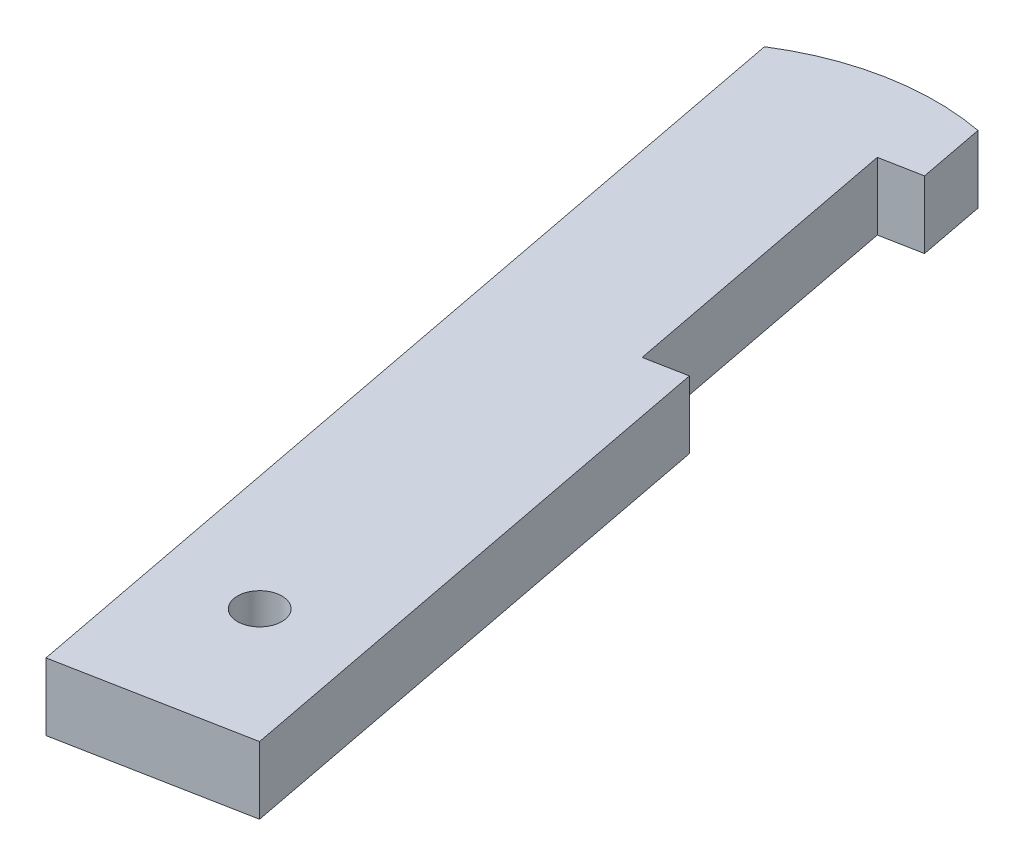
ISO-10303-21;
HEADER;
FILE_DESCRIPTION(('STEP AP214'),'2;1');
FILE_NAME('part.step','',(''),(''),'','','');
FILE_SCHEMA(('AUTOMOTIVE_DESIGN { 1 0 10303 214 1 1 1 1 }'));
ENDSEC;
DATA;
#1=APPLICATION_CONTEXT('core data for automotive mechanical design processes');
#2=APPLICATION_PROTOCOL_DEFINITION('international standard','automotive_design',2000,#1);
#3=PRODUCT_CONTEXT('',#1,'mechanical');
#4=PRODUCT('Part','Part','',(#3));
#5=PRODUCT_RELATED_PRODUCT_CATEGORY('part','',(#4));
#6=PRODUCT_DEFINITION_FORMATION('','',#4);
#7=PRODUCT_DEFINITION_CONTEXT('part definition',#1,'design');
#8=PRODUCT_DEFINITION('design','',#6,#7);
#9=PRODUCT_DEFINITION_SHAPE('','',#8);
#10=(LENGTH_UNIT() NAMED_UNIT(*) SI_UNIT(.MILLI.,.METRE.));
#11=(NAMED_UNIT(*) PLANE_ANGLE_UNIT() SI_UNIT($,.RADIAN.));
#12=(NAMED_UNIT(*) SI_UNIT($,.STERADIAN.) SOLID_ANGLE_UNIT());
#13=UNCERTAINTY_MEASURE_WITH_UNIT(LENGTH_MEASURE(1.E-05),#10,'distance_accuracy_value','');
#14=(GEOMETRIC_REPRESENTATION_CONTEXT(3) GLOBAL_UNCERTAINTY_ASSIGNED_CONTEXT((#13)) GLOBAL_UNIT_ASSIGNED_CONTEXT((#10,
#11,#12)) REPRESENTATION_CONTEXT('',''));
#15=CARTESIAN_POINT('',(0.,0.,0.));
#16=DIRECTION('',(0.,0.,1.));
#17=DIRECTION('',(1.,0.,0.));
#18=AXIS2_PLACEMENT_3D('',#15,#16,#17);
#19=CARTESIAN_POINT('',(0.,5.,0.));
#20=DIRECTION('',(0.,1.,0.));
#21=DIRECTION('',(0.,0.,1.));
#22=AXIS2_PLACEMENT_3D('',#19,#20,#21);
#23=PLANE('',#22);
#24=CARTESIAN_POINT('',(0.,5.,0.));
#25=DIRECTION('',(0.,1.,0.));
#26=DIRECTION('',(0.,0.,1.));
#27=AXIS2_PLACEMENT_3D('',#24,#25,#26);
#28=CIRCLE('',#27,18.5);
#29=CARTESIAN_POINT('',(3.42343920553594,5.,-18.1804858022551));
#30=VERTEX_POINT('',#29);
#31=CARTESIAN_POINT('',(-9.89482128749764,5.,-15.6314590390176));
#32=VERTEX_POINT('',#31);
#33=EDGE_CURVE('E145',#30,#32,#28,.T.);
#34=ORIENTED_EDGE('',*,*,#33,.T.);
#35=DIRECTION('',(0.187981324722533,0.,0.982172602731089));
#36=VECTOR('',#35,1.);
#37=CARTESIAN_POINT('',(-9.89482128749764,5.,-15.6314590390176));
#38=LINE('',#37,#36);
#39=CARTESIAN_POINT('',(2.73993598960987,5.,50.3831435181732));
#40=VERTEX_POINT('',#39);
#41=EDGE_CURVE('E93',#32,#40,#38,.T.);
#42=ORIENTED_EDGE('',*,*,#41,.T.);
#43=DIRECTION('',(0.982172602731089,0.,-0.187981324722533));
#44=VECTOR('',#43,1.);
#45=CARTESIAN_POINT('',(2.73993598960987,5.,50.3831435181732));
#46=LINE('',#45,#44);
#47=CARTESIAN_POINT('',(16.0581964826435,5.,47.8341167549357));
#48=VERTEX_POINT('',#47);
#49=EDGE_CURVE('E160',#40,#48,#46,.T.);
#50=ORIENTED_EDGE('',*,*,#49,.T.);
#51=DIRECTION('',(-0.187981324722534,0.,-0.982172602731089));
#52=VECTOR('',#51,1.);
#53=CARTESIAN_POINT('',(8.49893497304433,5.,8.3381744714843));
#54=LINE('',#53,#52);
#55=CARTESIAN_POINT('',(8.49893497304433,5.,8.3381744714843));
#56=VERTEX_POINT('',#55);
#57=EDGE_CURVE('E173',#48,#56,#54,.T.);
#58=ORIENTED_EDGE('',*,*,#57,.T.);
#59=DIRECTION('',(-0.982172602731089,0.,0.187981324722533));
#60=VECTOR('',#59,1.);
#61=CARTESIAN_POINT('',(5.55241716485106,5.,8.9021184456519));
#62=LINE('',#61,#60);
#63=CARTESIAN_POINT('',(5.55241716485106,5.,8.9021184456519));
#64=VERTEX_POINT('',#63);
#65=EDGE_CURVE('E112',#56,#64,#62,.T.);
#66=ORIENTED_EDGE('',*,*,#65,.T.);
#67=DIRECTION('',(-0.187981324722533,0.,-0.982172602731089));
#68=VECTOR('',#67,1.);
#69=CARTESIAN_POINT('',(1.41682802095533,5.,-12.7056788144321));
#70=LINE('',#69,#68);
#71=CARTESIAN_POINT('',(1.41682802095533,5.,-12.7056788144321));
#72=VERTEX_POINT('',#71);
#73=EDGE_CURVE('E106',#64,#72,#70,.T.);
#74=ORIENTED_EDGE('',*,*,#73,.T.);
#75=DIRECTION('',(0.982172602731089,0.,-0.187981324722533));
#76=VECTOR('',#75,1.);
#77=CARTESIAN_POINT('',(4.3633458291486,5.,-13.2696227885997));
#78=LINE('',#77,#76);
#79=CARTESIAN_POINT('',(4.3633458291486,5.,-13.2696227885997));
#80=VERTEX_POINT('',#79);
#81=EDGE_CURVE('E110',#72,#80,#78,.T.);
#82=ORIENTED_EDGE('',*,*,#81,.T.);
#83=DIRECTION('',(-0.187981324722532,0.,-0.982172602731089));
#84=VECTOR('',#83,1.);
#85=CARTESIAN_POINT('',(3.42343920553594,5.,-18.1804858022551));
#86=LINE('',#85,#84);
#87=EDGE_CURVE('E50',#80,#30,#86,.T.);
#88=ORIENTED_EDGE('',*,*,#87,.T.);
#89=EDGE_LOOP('',(#34,#42,#50,#58,#66,#74,#82,#88));
#90=FACE_BOUND('',#89,.T.);
#91=CARTESIAN_POINT('',(7.51925298890133,5.,39.2869041092436));
#92=DIRECTION('',(0.,1.,0.));
#93=DIRECTION('',(0.,0.,1.));
#94=AXIS2_PLACEMENT_3D('',#91,#92,#93);
#95=CIRCLE('',#94,1.65);
#96=CARTESIAN_POINT('',(7.51925298890133,5.,40.9369041092436));
#97=VERTEX_POINT('',#96);
#98=EDGE_CURVE('E134',#97,#97,#95,.T.);
#99=ORIENTED_EDGE('',*,*,#98,.F.);
#100=EDGE_LOOP('',(#99));
#101=FACE_BOUND('',#100,.T.);
#102=ADVANCED_FACE('F33',(#90,#101),#23,.T.);
#103=CARTESIAN_POINT('',(0.,0.,0.));
#104=DIRECTION('',(0.,1.,0.));
#105=DIRECTION('',(0.,0.,1.));
#106=AXIS2_PLACEMENT_3D('',#103,#104,#105);
#107=PLANE('',#106);
#108=CARTESIAN_POINT('',(0.,0.,0.));
#109=DIRECTION('',(0.,1.,0.));
#110=DIRECTION('',(0.,0.,1.));
#111=AXIS2_PLACEMENT_3D('',#108,#109,#110);
#112=CIRCLE('',#111,18.5);
#113=CARTESIAN_POINT('',(3.42343920553594,0.,-18.1804858022551));
#114=VERTEX_POINT('',#113);
#115=CARTESIAN_POINT('',(-9.89482128749764,0.,-15.6314590390176));
#116=VERTEX_POINT('',#115);
#117=EDGE_CURVE('E130',#114,#116,#112,.T.);
#118=ORIENTED_EDGE('',*,*,#117,.F.);
#119=DIRECTION('',(-0.187981324722532,0.,-0.982172602731089));
#120=VECTOR('',#119,1.);
#121=CARTESIAN_POINT('',(3.42343920553594,0.,-18.1804858022551));
#122=LINE('',#121,#120);
#123=CARTESIAN_POINT('',(4.3633458291486,0.,-13.2696227885997));
#124=VERTEX_POINT('',#123);
#125=EDGE_CURVE('E85',#124,#114,#122,.T.);
#126=ORIENTED_EDGE('',*,*,#125,.F.);
#127=DIRECTION('',(0.982172602731089,0.,-0.187981324722533));
#128=VECTOR('',#127,1.);
#129=CARTESIAN_POINT('',(4.3633458291486,0.,-13.2696227885997));
#130=LINE('',#129,#128);
#131=CARTESIAN_POINT('',(1.41682802095533,0.,-12.7056788144321));
#132=VERTEX_POINT('',#131);
#133=EDGE_CURVE('E79',#132,#124,#130,.T.);
#134=ORIENTED_EDGE('',*,*,#133,.F.);
#135=DIRECTION('',(-0.187981324722533,0.,-0.982172602731089));
#136=VECTOR('',#135,1.);
#137=CARTESIAN_POINT('',(1.41682802095533,0.,-12.7056788144321));
#138=LINE('',#137,#136);
#139=CARTESIAN_POINT('',(5.55241716485106,0.,8.9021184456519));
#140=VERTEX_POINT('',#139);
#141=EDGE_CURVE('E120',#140,#132,#138,.T.);
#142=ORIENTED_EDGE('',*,*,#141,.F.);
#143=DIRECTION('',(-0.982172602731089,0.,0.187981324722533));
#144=VECTOR('',#143,1.);
#145=CARTESIAN_POINT('',(5.55241716485106,0.,8.9021184456519));
#146=LINE('',#145,#144);
#147=CARTESIAN_POINT('',(8.49893497304433,0.,8.3381744714843));
#148=VERTEX_POINT('',#147);
#149=EDGE_CURVE('E140',#148,#140,#146,.T.);
#150=ORIENTED_EDGE('',*,*,#149,.F.);
#151=DIRECTION('',(-0.187981324722534,0.,-0.982172602731089));
#152=VECTOR('',#151,1.);
#153=CARTESIAN_POINT('',(8.49893497304433,0.,8.3381744714843));
#154=LINE('',#153,#152);
#155=CARTESIAN_POINT('',(16.0581964826435,0.,47.8341167549357));
#156=VERTEX_POINT('',#155);
#157=EDGE_CURVE('E138',#156,#148,#154,.T.);
#158=ORIENTED_EDGE('',*,*,#157,.F.);
#159=DIRECTION('',(0.982172602731089,0.,-0.187981324722533));
#160=VECTOR('',#159,1.);
#161=CARTESIAN_POINT('',(2.73993598960987,0.,50.3831435181732));
#162=LINE('',#161,#160);
#163=CARTESIAN_POINT('',(2.73993598960987,0.,50.3831435181732));
#164=VERTEX_POINT('',#163);
#165=EDGE_CURVE('E136',#164,#156,#162,.T.);
#166=ORIENTED_EDGE('',*,*,#165,.F.);
#167=DIRECTION('',(0.187981324722533,0.,0.982172602731089));
#168=VECTOR('',#167,1.);
#169=CARTESIAN_POINT('',(-9.89482128749764,0.,-15.6314590390176));
#170=LINE('',#169,#168);
#171=EDGE_CURVE('E133',#116,#164,#170,.T.);
#172=ORIENTED_EDGE('',*,*,#171,.F.);
#173=EDGE_LOOP('',(#118,#126,#134,#142,#150,#158,#166,#172));
#174=FACE_BOUND('',#173,.T.);
#175=CARTESIAN_POINT('',(7.51925298890133,0.,39.2869041092436));
#176=DIRECTION('',(0.,1.,0.));
#177=DIRECTION('',(0.,0.,1.));
#178=AXIS2_PLACEMENT_3D('',#175,#176,#177);
#179=CIRCLE('',#178,1.65);
#180=CARTESIAN_POINT('',(7.51925298890133,0.,40.9369041092436));
#181=VERTEX_POINT('',#180);
#182=EDGE_CURVE('E179',#181,#181,#179,.T.);
#183=ORIENTED_EDGE('',*,*,#182,.T.);
#184=EDGE_LOOP('',(#183));
#185=FACE_BOUND('',#184,.T.);
#186=ADVANCED_FACE('F164',(#174,#185),#107,.F.);
#187=CARTESIAN_POINT('',(0.,5.,0.));
#188=DIRECTION('',(0.,-1.,0.));
#189=DIRECTION('',(0.,0.,-1.));
#190=AXIS2_PLACEMENT_3D('',#187,#188,#189);
#191=CYLINDRICAL_SURFACE('',#190,18.5);
#192=ORIENTED_EDGE('',*,*,#117,.T.);
#193=DIRECTION('',(0.,-1.,0.));
#194=VECTOR('',#193,1.);
#195=CARTESIAN_POINT('',(-9.89482128749764,5.,-15.6314590390176));
#196=LINE('',#195,#194);
#197=EDGE_CURVE('E11',#32,#116,#196,.T.);
#198=ORIENTED_EDGE('',*,*,#197,.F.);
#199=ORIENTED_EDGE('',*,*,#33,.F.);
#200=DIRECTION('',(0.,-1.,0.));
#201=VECTOR('',#200,1.);
#202=CARTESIAN_POINT('',(3.42343920553594,5.,-18.1804858022551));
#203=LINE('',#202,#201);
#204=EDGE_CURVE('E126',#30,#114,#203,.T.);
#205=ORIENTED_EDGE('',*,*,#204,.T.);
#206=EDGE_LOOP('',(#192,#198,#199,#205));
#207=FACE_BOUND('',#206,.T.);
#208=ADVANCED_FACE('F35',(#207),#191,.T.);
#209=CARTESIAN_POINT('',(-9.89482128749764,5.,-15.6314590390176));
#210=DIRECTION('',(0.982172602731089,0.,-0.187981324722533));
#211=DIRECTION('',(-0.187981324722533,0.,-0.982172602731089));
#212=AXIS2_PLACEMENT_3D('',#209,#210,#211);
#213=PLANE('',#212);
#214=ORIENTED_EDGE('',*,*,#171,.T.);
#215=DIRECTION('',(0.,-1.,0.));
#216=VECTOR('',#215,1.);
#217=CARTESIAN_POINT('',(2.73993598960987,5.,50.3831435181732));
#218=LINE('',#217,#216);
#219=EDGE_CURVE('E42',#40,#164,#218,.T.);
#220=ORIENTED_EDGE('',*,*,#219,.F.);
#221=ORIENTED_EDGE('',*,*,#41,.F.);
#222=ORIENTED_EDGE('',*,*,#197,.T.);
#223=EDGE_LOOP('',(#214,#220,#221,#222));
#224=FACE_BOUND('',#223,.T.);
#225=ADVANCED_FACE('F207',(#224),#213,.F.);
#226=CARTESIAN_POINT('',(2.73993598960987,5.,50.3831435181732));
#227=DIRECTION('',(-0.187981324722533,0.,-0.982172602731089));
#228=DIRECTION('',(-0.982172602731089,0.,0.187981324722533));
#229=AXIS2_PLACEMENT_3D('',#226,#227,#228);
#230=PLANE('',#229);
#231=ORIENTED_EDGE('',*,*,#165,.T.);
#232=DIRECTION('',(0.,-1.,0.));
#233=VECTOR('',#232,1.);
#234=CARTESIAN_POINT('',(16.0581964826435,5.,47.8341167549357));
#235=LINE('',#234,#233);
#236=EDGE_CURVE('E152',#48,#156,#235,.T.);
#237=ORIENTED_EDGE('',*,*,#236,.F.);
#238=ORIENTED_EDGE('',*,*,#49,.F.);
#239=ORIENTED_EDGE('',*,*,#219,.T.);
#240=EDGE_LOOP('',(#231,#237,#238,#239));
#241=FACE_BOUND('',#240,.T.);
#242=ADVANCED_FACE('F158',(#241),#230,.F.);
#243=CARTESIAN_POINT('',(8.49893497304433,5.,8.3381744714843));
#244=DIRECTION('',(-0.982172602731089,0.,0.187981324722534));
#245=DIRECTION('',(0.187981324722534,0.,0.982172602731089));
#246=AXIS2_PLACEMENT_3D('',#243,#244,#245);
#247=PLANE('',#246);
#248=ORIENTED_EDGE('',*,*,#157,.T.);
#249=DIRECTION('',(0.,-1.,0.));
#250=VECTOR('',#249,1.);
#251=CARTESIAN_POINT('',(8.49893497304433,5.,8.3381744714843));
#252=LINE('',#251,#250);
#253=EDGE_CURVE('E149',#56,#148,#252,.T.);
#254=ORIENTED_EDGE('',*,*,#253,.F.);
#255=ORIENTED_EDGE('',*,*,#57,.F.);
#256=ORIENTED_EDGE('',*,*,#236,.T.);
#257=EDGE_LOOP('',(#248,#254,#255,#256));
#258=FACE_BOUND('',#257,.T.);
#259=ADVANCED_FACE('F169',(#258),#247,.F.);
#260=CARTESIAN_POINT('',(5.55241716485106,5.,8.9021184456519));
#261=DIRECTION('',(0.187981324722533,0.,0.982172602731089));
#262=DIRECTION('',(0.982172602731089,0.,-0.187981324722533));
#263=AXIS2_PLACEMENT_3D('',#260,#261,#262);
#264=PLANE('',#263);
#265=ORIENTED_EDGE('',*,*,#149,.T.);
#266=DIRECTION('',(0.,-1.,0.));
#267=VECTOR('',#266,1.);
#268=CARTESIAN_POINT('',(5.55241716485106,5.,8.9021184456519));
#269=LINE('',#268,#267);
#270=EDGE_CURVE('E121',#64,#140,#269,.T.);
#271=ORIENTED_EDGE('',*,*,#270,.F.);
#272=ORIENTED_EDGE('',*,*,#65,.F.);
#273=ORIENTED_EDGE('',*,*,#253,.T.);
#274=EDGE_LOOP('',(#265,#271,#272,#273));
#275=FACE_BOUND('',#274,.T.);
#276=ADVANCED_FACE('F172',(#275),#264,.F.);
#277=CARTESIAN_POINT('',(1.41682802095533,5.,-12.7056788144321));
#278=DIRECTION('',(-0.982172602731089,0.,0.187981324722533));
#279=DIRECTION('',(0.187981324722533,0.,0.982172602731089));
#280=AXIS2_PLACEMENT_3D('',#277,#278,#279);
#281=PLANE('',#280);
#282=ORIENTED_EDGE('',*,*,#141,.T.);
#283=DIRECTION('',(0.,-1.,0.));
#284=VECTOR('',#283,1.);
#285=CARTESIAN_POINT('',(1.41682802095533,5.,-12.7056788144321));
#286=LINE('',#285,#284);
#287=EDGE_CURVE('E117',#72,#132,#286,.T.);
#288=ORIENTED_EDGE('',*,*,#287,.F.);
#289=ORIENTED_EDGE('',*,*,#73,.F.);
#290=ORIENTED_EDGE('',*,*,#270,.T.);
#291=EDGE_LOOP('',(#282,#288,#289,#290));
#292=FACE_BOUND('',#291,.T.);
#293=ADVANCED_FACE('F118',(#292),#281,.F.);
#294=CARTESIAN_POINT('',(4.3633458291486,5.,-13.2696227885997));
#295=DIRECTION('',(-0.187981324722533,0.,-0.982172602731089));
#296=DIRECTION('',(-0.982172602731089,0.,0.187981324722533));
#297=AXIS2_PLACEMENT_3D('',#294,#295,#296);
#298=PLANE('',#297);
#299=ORIENTED_EDGE('',*,*,#133,.T.);
#300=DIRECTION('',(0.,-1.,0.));
#301=VECTOR('',#300,1.);
#302=CARTESIAN_POINT('',(4.3633458291486,5.,-13.2696227885997));
#303=LINE('',#302,#301);
#304=EDGE_CURVE('E122',#80,#124,#303,.T.);
#305=ORIENTED_EDGE('',*,*,#304,.F.);
#306=ORIENTED_EDGE('',*,*,#81,.F.);
#307=ORIENTED_EDGE('',*,*,#287,.T.);
#308=EDGE_LOOP('',(#299,#305,#306,#307));
#309=FACE_BOUND('',#308,.T.);
#310=ADVANCED_FACE('F124',(#309),#298,.F.);
#311=CARTESIAN_POINT('',(3.42343920553594,5.,-18.1804858022551));
#312=DIRECTION('',(-0.982172602731089,0.,0.187981324722532));
#313=DIRECTION('',(0.187981324722532,0.,0.982172602731089));
#314=AXIS2_PLACEMENT_3D('',#311,#312,#313);
#315=PLANE('',#314);
#316=ORIENTED_EDGE('',*,*,#125,.T.);
#317=ORIENTED_EDGE('',*,*,#204,.F.);
#318=ORIENTED_EDGE('',*,*,#87,.F.);
#319=ORIENTED_EDGE('',*,*,#304,.T.);
#320=EDGE_LOOP('',(#316,#317,#318,#319));
#321=FACE_BOUND('',#320,.T.);
#322=ADVANCED_FACE('F195',(#321),#315,.F.);
#323=CARTESIAN_POINT('',(7.51925298890133,5.,39.2869041092436));
#324=DIRECTION('',(0.,-1.,0.));
#325=DIRECTION('',(0.,0.,-1.));
#326=AXIS2_PLACEMENT_3D('',#323,#324,#325);
#327=CYLINDRICAL_SURFACE('',#326,1.65);
#328=ORIENTED_EDGE('',*,*,#98,.T.);
#329=EDGE_LOOP('',(#328));
#330=FACE_BOUND('',#329,.T.);
#331=ORIENTED_EDGE('',*,*,#182,.F.);
#332=EDGE_LOOP('',(#331));
#333=FACE_BOUND('',#332,.T.);
#334=ADVANCED_FACE('F185',(#330,#333),#327,.F.);
#335=CLOSED_SHELL('',(#102,#186,#208,#225,#242,#259,#276,#293,#310,#322,#334));
#336=MANIFOLD_SOLID_BREP('B2',#335);
#337=ADVANCED_BREP_SHAPE_REPRESENTATION('',(#18,#336),#14);
#338=SHAPE_DEFINITION_REPRESENTATION(#9,#337);
ENDSEC;
END-ISO-10303-21;
